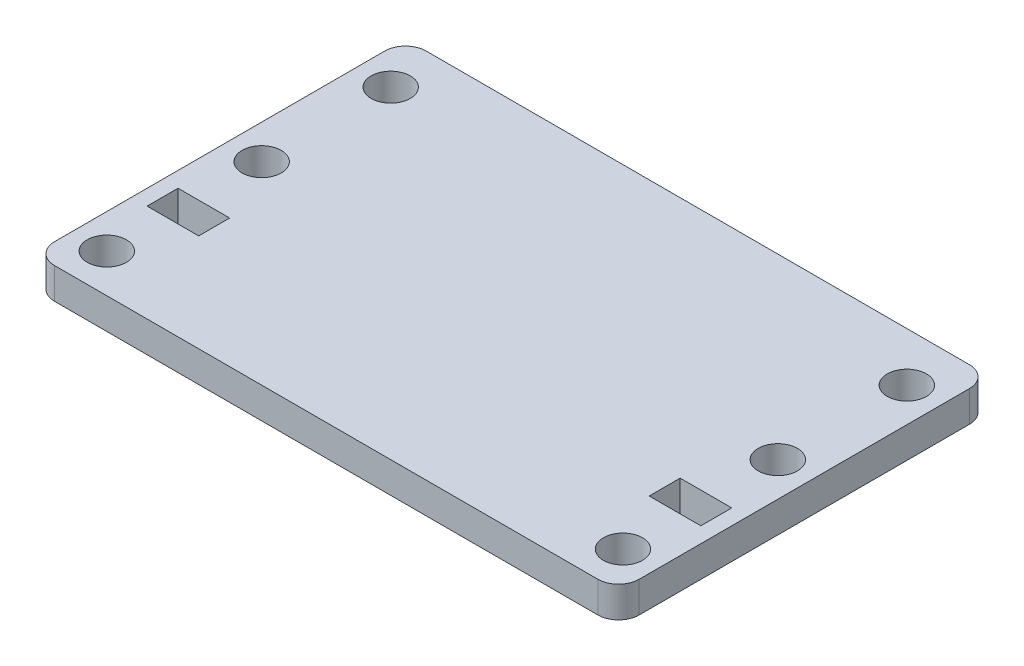
ISO-10303-21;
HEADER;
FILE_DESCRIPTION(('STEP AP214'),'2;1');
FILE_NAME('part.step','',(''),(''),'','','');
FILE_SCHEMA(('AUTOMOTIVE_DESIGN { 1 0 10303 214 1 1 1 1 }'));
ENDSEC;
DATA;
#1=APPLICATION_CONTEXT('core data for automotive mechanical design processes');
#2=APPLICATION_PROTOCOL_DEFINITION('international standard','automotive_design',2000,#1);
#3=PRODUCT_CONTEXT('',#1,'mechanical');
#4=PRODUCT('Part','Part','',(#3));
#5=PRODUCT_RELATED_PRODUCT_CATEGORY('part','',(#4));
#6=PRODUCT_DEFINITION_FORMATION('','',#4);
#7=PRODUCT_DEFINITION_CONTEXT('part definition',#1,'design');
#8=PRODUCT_DEFINITION('design','',#6,#7);
#9=PRODUCT_DEFINITION_SHAPE('','',#8);
#10=(LENGTH_UNIT() NAMED_UNIT(*) SI_UNIT(.MILLI.,.METRE.));
#11=(NAMED_UNIT(*) PLANE_ANGLE_UNIT() SI_UNIT($,.RADIAN.));
#12=(NAMED_UNIT(*) SI_UNIT($,.STERADIAN.) SOLID_ANGLE_UNIT());
#13=UNCERTAINTY_MEASURE_WITH_UNIT(LENGTH_MEASURE(1.E-05),#10,'distance_accuracy_value','');
#14=(GEOMETRIC_REPRESENTATION_CONTEXT(3) GLOBAL_UNCERTAINTY_ASSIGNED_CONTEXT((#13)) GLOBAL_UNIT_ASSIGNED_CONTEXT((#10,
#11,#12)) REPRESENTATION_CONTEXT('',''));
#15=CARTESIAN_POINT('',(0.,0.,0.));
#16=DIRECTION('',(0.,0.,1.));
#17=DIRECTION('',(1.,0.,0.));
#18=AXIS2_PLACEMENT_3D('',#15,#16,#17);
#19=CARTESIAN_POINT('',(0.,0.,0.));
#20=DIRECTION('',(0.,-1.,0.));
#21=DIRECTION('',(0.,0.,-1.));
#22=AXIS2_PLACEMENT_3D('',#19,#20,#21);
#23=PLANE('',#22);
#24=DIRECTION('',(0.,0.,-1.));
#25=VECTOR('',#24,1.);
#26=CARTESIAN_POINT('',(-55.14,0.,0.));
#27=LINE('',#26,#25);
#28=CARTESIAN_POINT('',(-55.14,0.,-9.47));
#29=VERTEX_POINT('',#28);
#30=CARTESIAN_POINT('',(-55.14,0.,-12.47));
#31=VERTEX_POINT('',#30);
#32=EDGE_CURVE('E215',#29,#31,#27,.T.);
#33=ORIENTED_EDGE('',*,*,#32,.F.);
#34=DIRECTION('',(-1.,0.,0.));
#35=VECTOR('',#34,1.);
#36=CARTESIAN_POINT('',(0.,0.,-9.46999999999998));
#37=LINE('',#36,#35);
#38=CARTESIAN_POINT('',(-50.14,0.,-9.47));
#39=VERTEX_POINT('',#38);
#40=EDGE_CURVE('E210',#39,#29,#37,.T.);
#41=ORIENTED_EDGE('',*,*,#40,.F.);
#42=DIRECTION('',(0.,0.,1.));
#43=VECTOR('',#42,1.);
#44=CARTESIAN_POINT('',(-50.14,0.,0.));
#45=LINE('',#44,#43);
#46=CARTESIAN_POINT('',(-50.14,0.,-12.47));
#47=VERTEX_POINT('',#46);
#48=EDGE_CURVE('E154',#47,#39,#45,.T.);
#49=ORIENTED_EDGE('',*,*,#48,.F.);
#50=DIRECTION('',(1.,0.,0.));
#51=VECTOR('',#50,1.);
#52=CARTESIAN_POINT('',(0.,0.,-12.47));
#53=LINE('',#52,#51);
#54=EDGE_CURVE('E213',#31,#47,#53,.T.);
#55=ORIENTED_EDGE('',*,*,#54,.F.);
#56=EDGE_LOOP('',(#33,#41,#49,#55));
#57=FACE_BOUND('',#56,.T.);
#58=DIRECTION('',(0.,0.,-1.));
#59=VECTOR('',#58,1.);
#60=CARTESIAN_POINT('',(-6.49999999999999,0.,0.));
#61=LINE('',#60,#59);
#62=CARTESIAN_POINT('',(-6.5,0.,-9.47));
#63=VERTEX_POINT('',#62);
#64=CARTESIAN_POINT('',(-6.5,0.,-12.47));
#65=VERTEX_POINT('',#64);
#66=EDGE_CURVE('E208',#63,#65,#61,.T.);
#67=ORIENTED_EDGE('',*,*,#66,.F.);
#68=DIRECTION('',(-1.,0.,0.));
#69=VECTOR('',#68,1.);
#70=CARTESIAN_POINT('',(0.,0.,-9.47));
#71=LINE('',#70,#69);
#72=CARTESIAN_POINT('',(-1.5,0.,-9.47));
#73=VERTEX_POINT('',#72);
#74=EDGE_CURVE('E179',#73,#63,#71,.T.);
#75=ORIENTED_EDGE('',*,*,#74,.F.);
#76=DIRECTION('',(0.,0.,1.));
#77=VECTOR('',#76,1.);
#78=CARTESIAN_POINT('',(-1.5,0.,0.));
#79=LINE('',#78,#77);
#80=CARTESIAN_POINT('',(-1.5,0.,-12.47));
#81=VERTEX_POINT('',#80);
#82=EDGE_CURVE('E203',#81,#73,#79,.T.);
#83=ORIENTED_EDGE('',*,*,#82,.F.);
#84=DIRECTION('',(1.,0.,0.));
#85=VECTOR('',#84,1.);
#86=CARTESIAN_POINT('',(0.,0.,-12.47));
#87=LINE('',#86,#85);
#88=EDGE_CURVE('E206',#65,#81,#87,.T.);
#89=ORIENTED_EDGE('',*,*,#88,.F.);
#90=EDGE_LOOP('',(#67,#75,#83,#89));
#91=FACE_BOUND('',#90,.T.);
#92=CARTESIAN_POINT('',(-53.32,0.,-31.25));
#93=DIRECTION('',(0.,1.,0.));
#94=DIRECTION('',(0.,0.,1.));
#95=AXIS2_PLACEMENT_3D('',#92,#93,#94);
#96=CIRCLE('',#95,1.89865);
#97=CARTESIAN_POINT('',(-53.32,0.,-29.35135));
#98=VERTEX_POINT('',#97);
#99=EDGE_CURVE('E220',#98,#98,#96,.T.);
#100=ORIENTED_EDGE('',*,*,#99,.T.);
#101=EDGE_LOOP('',(#100));
#102=FACE_BOUND('',#101,.T.);
#103=CARTESIAN_POINT('',(-3.31999999999999,0.,-18.75));
#104=DIRECTION('',(0.,1.,0.));
#105=DIRECTION('',(0.,0.,1.));
#106=AXIS2_PLACEMENT_3D('',#103,#104,#105);
#107=CIRCLE('',#106,1.89865);
#108=CARTESIAN_POINT('',(-3.31999999999999,0.,-16.85135));
#109=VERTEX_POINT('',#108);
#110=EDGE_CURVE('E244',#109,#109,#107,.T.);
#111=ORIENTED_EDGE('',*,*,#110,.T.);
#112=EDGE_LOOP('',(#111));
#113=FACE_BOUND('',#112,.T.);
#114=CARTESIAN_POINT('',(-3.31999999999999,0.,-3.75));
#115=DIRECTION('',(0.,1.,0.));
#116=DIRECTION('',(0.,0.,1.));
#117=AXIS2_PLACEMENT_3D('',#114,#115,#116);
#118=CIRCLE('',#117,1.89865);
#119=CARTESIAN_POINT('',(-3.31999999999999,0.,-1.85135));
#120=VERTEX_POINT('',#119);
#121=EDGE_CURVE('E250',#120,#120,#118,.T.);
#122=ORIENTED_EDGE('',*,*,#121,.T.);
#123=EDGE_LOOP('',(#122));
#124=FACE_BOUND('',#123,.T.);
#125=DIRECTION('',(0.,0.,1.));
#126=VECTOR('',#125,1.);
#127=CARTESIAN_POINT('',(-56.64,0.,-36.));
#128=LINE('',#127,#126);
#129=CARTESIAN_POINT('',(-56.64,0.,-34.));
#130=VERTEX_POINT('',#129);
#131=CARTESIAN_POINT('',(-56.64,0.,-2.));
#132=VERTEX_POINT('',#131);
#133=EDGE_CURVE('E271',#130,#132,#128,.T.);
#134=ORIENTED_EDGE('',*,*,#133,.F.);
#135=CARTESIAN_POINT('',(-54.64,0.,-34.));
#136=DIRECTION('',(0.,-1.,0.));
#137=DIRECTION('',(0.,0.,-1.));
#138=AXIS2_PLACEMENT_3D('',#135,#136,#137);
#139=CIRCLE('',#138,2.);
#140=CARTESIAN_POINT('',(-54.64,0.,-36.));
#141=VERTEX_POINT('',#140);
#142=EDGE_CURVE('E285',#130,#141,#139,.T.);
#143=ORIENTED_EDGE('',*,*,#142,.T.);
#144=DIRECTION('',(-1.,0.,0.));
#145=VECTOR('',#144,1.);
#146=CARTESIAN_POINT('',(0.,0.,-36.));
#147=LINE('',#146,#145);
#148=CARTESIAN_POINT('',(-2.,0.,-36.));
#149=VERTEX_POINT('',#148);
#150=EDGE_CURVE('E268',#149,#141,#147,.T.);
#151=ORIENTED_EDGE('',*,*,#150,.F.);
#152=CARTESIAN_POINT('',(-2.,0.,-34.));
#153=DIRECTION('',(0.,-1.,0.));
#154=DIRECTION('',(0.,0.,-1.));
#155=AXIS2_PLACEMENT_3D('',#152,#153,#154);
#156=CIRCLE('',#155,2.);
#157=CARTESIAN_POINT('',(0.,0.,-34.));
#158=VERTEX_POINT('',#157);
#159=EDGE_CURVE('E283',#149,#158,#156,.T.);
#160=ORIENTED_EDGE('',*,*,#159,.T.);
#161=DIRECTION('',(0.,0.,-1.));
#162=VECTOR('',#161,1.);
#163=CARTESIAN_POINT('',(0.,0.,-36.));
#164=LINE('',#163,#162);
#165=CARTESIAN_POINT('',(0.,0.,-2.));
#166=VERTEX_POINT('',#165);
#167=EDGE_CURVE('E253',#166,#158,#164,.T.);
#168=ORIENTED_EDGE('',*,*,#167,.F.);
#169=CARTESIAN_POINT('',(-2.,0.,-2.));
#170=DIRECTION('',(0.,-1.,0.));
#171=DIRECTION('',(0.,0.,-1.));
#172=AXIS2_PLACEMENT_3D('',#169,#170,#171);
#173=CIRCLE('',#172,2.);
#174=CARTESIAN_POINT('',(-2.,0.,0.));
#175=VERTEX_POINT('',#174);
#176=EDGE_CURVE('E281',#166,#175,#173,.T.);
#177=ORIENTED_EDGE('',*,*,#176,.T.);
#178=DIRECTION('',(1.,0.,0.));
#179=VECTOR('',#178,1.);
#180=CARTESIAN_POINT('',(0.,0.,0.));
#181=LINE('',#180,#179);
#182=CARTESIAN_POINT('',(-54.64,0.,0.));
#183=VERTEX_POINT('',#182);
#184=EDGE_CURVE('E258',#183,#175,#181,.T.);
#185=ORIENTED_EDGE('',*,*,#184,.F.);
#186=CARTESIAN_POINT('',(-54.64,0.,-2.));
#187=DIRECTION('',(0.,-1.,0.));
#188=DIRECTION('',(0.,0.,-1.));
#189=AXIS2_PLACEMENT_3D('',#186,#187,#188);
#190=CIRCLE('',#189,2.);
#191=EDGE_CURVE('E279',#183,#132,#190,.T.);
#192=ORIENTED_EDGE('',*,*,#191,.T.);
#193=EDGE_LOOP('',(#134,#143,#151,#160,#168,#177,#185,#192));
#194=FACE_BOUND('',#193,.T.);
#195=CARTESIAN_POINT('',(-3.31999999999999,0.,-31.25));
#196=DIRECTION('',(0.,1.,0.));
#197=DIRECTION('',(0.,0.,1.));
#198=AXIS2_PLACEMENT_3D('',#195,#196,#197);
#199=CIRCLE('',#198,1.89865);
#200=CARTESIAN_POINT('',(-3.31999999999999,0.,-29.35135));
#201=VERTEX_POINT('',#200);
#202=EDGE_CURVE('E238',#201,#201,#199,.T.);
#203=ORIENTED_EDGE('',*,*,#202,.T.);
#204=EDGE_LOOP('',(#203));
#205=FACE_BOUND('',#204,.T.);
#206=CARTESIAN_POINT('',(-53.32,0.,-3.75));
#207=DIRECTION('',(0.,1.,0.));
#208=DIRECTION('',(0.,0.,1.));
#209=AXIS2_PLACEMENT_3D('',#206,#207,#208);
#210=CIRCLE('',#209,1.89865);
#211=CARTESIAN_POINT('',(-53.32,0.,-1.85135));
#212=VERTEX_POINT('',#211);
#213=EDGE_CURVE('E232',#212,#212,#210,.T.);
#214=ORIENTED_EDGE('',*,*,#213,.T.);
#215=EDGE_LOOP('',(#214));
#216=FACE_BOUND('',#215,.T.);
#217=CARTESIAN_POINT('',(-53.32,0.,-18.75));
#218=DIRECTION('',(0.,1.,0.));
#219=DIRECTION('',(0.,0.,1.));
#220=AXIS2_PLACEMENT_3D('',#217,#218,#219);
#221=CIRCLE('',#220,1.89865);
#222=CARTESIAN_POINT('',(-53.32,0.,-16.85135));
#223=VERTEX_POINT('',#222);
#224=EDGE_CURVE('E226',#223,#223,#221,.T.);
#225=ORIENTED_EDGE('',*,*,#224,.T.);
#226=EDGE_LOOP('',(#225));
#227=FACE_BOUND('',#226,.T.);
#228=ADVANCED_FACE('F33',(#57,#91,#102,#113,#124,#194,#205,#216,#227),#23,.T.);
#229=CARTESIAN_POINT('',(0.,3.,-36.));
#230=DIRECTION('',(-1.,0.,0.));
#231=DIRECTION('',(0.,0.,1.));
#232=AXIS2_PLACEMENT_3D('',#229,#230,#231);
#233=PLANE('',#232);
#234=ORIENTED_EDGE('',*,*,#167,.T.);
#235=DIRECTION('',(0.,-1.,0.));
#236=VECTOR('',#235,1.);
#237=CARTESIAN_POINT('',(0.,3.,-34.));
#238=LINE('',#237,#236);
#239=CARTESIAN_POINT('',(0.,3.,-34.));
#240=VERTEX_POINT('',#239);
#241=EDGE_CURVE('E302',#158,#240,#238,.F.);
#242=ORIENTED_EDGE('',*,*,#241,.T.);
#243=DIRECTION('',(0.,0.,-1.));
#244=VECTOR('',#243,1.);
#245=CARTESIAN_POINT('',(0.,3.,-36.));
#246=LINE('',#245,#244);
#247=CARTESIAN_POINT('',(0.,3.,-2.));
#248=VERTEX_POINT('',#247);
#249=EDGE_CURVE('E254',#248,#240,#246,.T.);
#250=ORIENTED_EDGE('',*,*,#249,.F.);
#251=DIRECTION('',(0.,-1.,0.));
#252=VECTOR('',#251,1.);
#253=CARTESIAN_POINT('',(0.,3.,-2.));
#254=LINE('',#253,#252);
#255=EDGE_CURVE('E299',#248,#166,#254,.T.);
#256=ORIENTED_EDGE('',*,*,#255,.T.);
#257=EDGE_LOOP('',(#234,#242,#250,#256));
#258=FACE_BOUND('',#257,.T.);
#259=ADVANCED_FACE('F318',(#258),#233,.F.);
#260=CARTESIAN_POINT('',(0.,3.,-36.));
#261=DIRECTION('',(0.,0.,1.));
#262=DIRECTION('',(1.,0.,0.));
#263=AXIS2_PLACEMENT_3D('',#260,#261,#262);
#264=PLANE('',#263);
#265=ORIENTED_EDGE('',*,*,#150,.T.);
#266=DIRECTION('',(0.,-1.,0.));
#267=VECTOR('',#266,1.);
#268=CARTESIAN_POINT('',(-54.64,3.,-36.));
#269=LINE('',#268,#267);
#270=CARTESIAN_POINT('',(-54.64,3.,-36.));
#271=VERTEX_POINT('',#270);
#272=EDGE_CURVE('E290',#141,#271,#269,.F.);
#273=ORIENTED_EDGE('',*,*,#272,.T.);
#274=DIRECTION('',(-1.,0.,0.));
#275=VECTOR('',#274,1.);
#276=CARTESIAN_POINT('',(0.,3.,-36.));
#277=LINE('',#276,#275);
#278=CARTESIAN_POINT('',(-2.,3.,-36.));
#279=VERTEX_POINT('',#278);
#280=EDGE_CURVE('E257',#279,#271,#277,.T.);
#281=ORIENTED_EDGE('',*,*,#280,.F.);
#282=DIRECTION('',(0.,-1.,0.));
#283=VECTOR('',#282,1.);
#284=CARTESIAN_POINT('',(-2.,3.,-36.));
#285=LINE('',#284,#283);
#286=EDGE_CURVE('E287',#279,#149,#285,.T.);
#287=ORIENTED_EDGE('',*,*,#286,.T.);
#288=EDGE_LOOP('',(#265,#273,#281,#287));
#289=FACE_BOUND('',#288,.T.);
#290=ADVANCED_FACE('F327',(#289),#264,.F.);
#291=CARTESIAN_POINT('',(-56.64,3.,-36.));
#292=DIRECTION('',(1.,0.,0.));
#293=DIRECTION('',(0.,0.,-1.));
#294=AXIS2_PLACEMENT_3D('',#291,#292,#293);
#295=PLANE('',#294);
#296=DIRECTION('',(0.,0.,1.));
#297=VECTOR('',#296,1.);
#298=CARTESIAN_POINT('',(-56.64,3.,-36.));
#299=LINE('',#298,#297);
#300=CARTESIAN_POINT('',(-56.64,3.,-34.));
#301=VERTEX_POINT('',#300);
#302=CARTESIAN_POINT('',(-56.64,3.,-2.));
#303=VERTEX_POINT('',#302);
#304=EDGE_CURVE('E261',#301,#303,#299,.T.);
#305=ORIENTED_EDGE('',*,*,#304,.F.);
#306=DIRECTION('',(0.,-1.,0.));
#307=VECTOR('',#306,1.);
#308=CARTESIAN_POINT('',(-56.64,3.,-34.));
#309=LINE('',#308,#307);
#310=EDGE_CURVE('E276',#301,#130,#309,.T.);
#311=ORIENTED_EDGE('',*,*,#310,.T.);
#312=ORIENTED_EDGE('',*,*,#133,.T.);
#313=DIRECTION('',(0.,-1.,0.));
#314=VECTOR('',#313,1.);
#315=CARTESIAN_POINT('',(-56.64,3.,-2.));
#316=LINE('',#315,#314);
#317=EDGE_CURVE('E265',#132,#303,#316,.F.);
#318=ORIENTED_EDGE('',*,*,#317,.T.);
#319=EDGE_LOOP('',(#305,#311,#312,#318));
#320=FACE_BOUND('',#319,.T.);
#321=ADVANCED_FACE('F335',(#320),#295,.F.);
#322=CARTESIAN_POINT('',(0.,3.,0.));
#323=DIRECTION('',(0.,0.,-1.));
#324=DIRECTION('',(-1.,0.,0.));
#325=AXIS2_PLACEMENT_3D('',#322,#323,#324);
#326=PLANE('',#325);
#327=ORIENTED_EDGE('',*,*,#184,.T.);
#328=DIRECTION('',(0.,-1.,0.));
#329=VECTOR('',#328,1.);
#330=CARTESIAN_POINT('',(-2.,3.,0.));
#331=LINE('',#330,#329);
#332=CARTESIAN_POINT('',(-2.,3.,0.));
#333=VERTEX_POINT('',#332);
#334=EDGE_CURVE('E11',#175,#333,#331,.F.);
#335=ORIENTED_EDGE('',*,*,#334,.T.);
#336=DIRECTION('',(1.,0.,0.));
#337=VECTOR('',#336,1.);
#338=CARTESIAN_POINT('',(0.,3.,0.));
#339=LINE('',#338,#337);
#340=CARTESIAN_POINT('',(-54.64,3.,0.));
#341=VERTEX_POINT('',#340);
#342=EDGE_CURVE('E263',#341,#333,#339,.T.);
#343=ORIENTED_EDGE('',*,*,#342,.F.);
#344=DIRECTION('',(0.,-1.,0.));
#345=VECTOR('',#344,1.);
#346=CARTESIAN_POINT('',(-54.64,3.,0.));
#347=LINE('',#346,#345);
#348=EDGE_CURVE('E41',#341,#183,#347,.T.);
#349=ORIENTED_EDGE('',*,*,#348,.T.);
#350=EDGE_LOOP('',(#327,#335,#343,#349));
#351=FACE_BOUND('',#350,.T.);
#352=ADVANCED_FACE('F306',(#351),#326,.F.);
#353=CARTESIAN_POINT('',(0.,3.,0.));
#354=DIRECTION('',(0.,-1.,0.));
#355=DIRECTION('',(0.,0.,-1.));
#356=AXIS2_PLACEMENT_3D('',#353,#354,#355);
#357=PLANE('',#356);
#358=DIRECTION('',(1.,0.,0.));
#359=VECTOR('',#358,1.);
#360=CARTESIAN_POINT('',(-55.14,3.,-9.47));
#361=LINE('',#360,#359);
#362=CARTESIAN_POINT('',(-55.14,3.,-9.47));
#363=VERTEX_POINT('',#362);
#364=CARTESIAN_POINT('',(-50.14,3.,-9.47));
#365=VERTEX_POINT('',#364);
#366=EDGE_CURVE('E162',#363,#365,#361,.T.);
#367=ORIENTED_EDGE('',*,*,#366,.F.);
#368=DIRECTION('',(0.,0.,1.));
#369=VECTOR('',#368,1.);
#370=CARTESIAN_POINT('',(-55.14,3.,-12.47));
#371=LINE('',#370,#369);
#372=CARTESIAN_POINT('',(-55.14,3.,-12.47));
#373=VERTEX_POINT('',#372);
#374=EDGE_CURVE('E167',#373,#363,#371,.T.);
#375=ORIENTED_EDGE('',*,*,#374,.F.);
#376=DIRECTION('',(-1.,0.,0.));
#377=VECTOR('',#376,1.);
#378=CARTESIAN_POINT('',(-55.14,3.,-12.47));
#379=LINE('',#378,#377);
#380=CARTESIAN_POINT('',(-50.14,3.,-12.47));
#381=VERTEX_POINT('',#380);
#382=EDGE_CURVE('E172',#381,#373,#379,.T.);
#383=ORIENTED_EDGE('',*,*,#382,.F.);
#384=DIRECTION('',(0.,0.,-1.));
#385=VECTOR('',#384,1.);
#386=CARTESIAN_POINT('',(-50.14,3.,-12.47));
#387=LINE('',#386,#385);
#388=EDGE_CURVE('E151',#365,#381,#387,.T.);
#389=ORIENTED_EDGE('',*,*,#388,.F.);
#390=EDGE_LOOP('',(#367,#375,#383,#389));
#391=FACE_BOUND('',#390,.T.);
#392=DIRECTION('',(1.,0.,0.));
#393=VECTOR('',#392,1.);
#394=CARTESIAN_POINT('',(-6.5,3.,-9.47));
#395=LINE('',#394,#393);
#396=CARTESIAN_POINT('',(-6.5,3.,-9.47));
#397=VERTEX_POINT('',#396);
#398=CARTESIAN_POINT('',(-1.5,3.,-9.47));
#399=VERTEX_POINT('',#398);
#400=EDGE_CURVE('E184',#397,#399,#395,.T.);
#401=ORIENTED_EDGE('',*,*,#400,.F.);
#402=DIRECTION('',(0.,0.,1.));
#403=VECTOR('',#402,1.);
#404=CARTESIAN_POINT('',(-6.5,3.,-12.47));
#405=LINE('',#404,#403);
#406=CARTESIAN_POINT('',(-6.5,3.,-12.47));
#407=VERTEX_POINT('',#406);
#408=EDGE_CURVE('E182',#407,#397,#405,.T.);
#409=ORIENTED_EDGE('',*,*,#408,.F.);
#410=DIRECTION('',(-1.,0.,0.));
#411=VECTOR('',#410,1.);
#412=CARTESIAN_POINT('',(-6.5,3.,-12.47));
#413=LINE('',#412,#411);
#414=CARTESIAN_POINT('',(-1.5,3.,-12.47));
#415=VERTEX_POINT('',#414);
#416=EDGE_CURVE('E190',#415,#407,#413,.T.);
#417=ORIENTED_EDGE('',*,*,#416,.F.);
#418=DIRECTION('',(0.,0.,-1.));
#419=VECTOR('',#418,1.);
#420=CARTESIAN_POINT('',(-1.5,3.,-12.47));
#421=LINE('',#420,#419);
#422=EDGE_CURVE('E187',#399,#415,#421,.T.);
#423=ORIENTED_EDGE('',*,*,#422,.F.);
#424=EDGE_LOOP('',(#401,#409,#417,#423));
#425=FACE_BOUND('',#424,.T.);
#426=CARTESIAN_POINT('',(-53.32,3.,-31.25));
#427=DIRECTION('',(0.,1.,0.));
#428=DIRECTION('',(0.,0.,1.));
#429=AXIS2_PLACEMENT_3D('',#426,#427,#428);
#430=CIRCLE('',#429,1.89864999999999);
#431=CARTESIAN_POINT('',(-53.32,3.,-29.35135));
#432=VERTEX_POINT('',#431);
#433=EDGE_CURVE('E217',#432,#432,#430,.T.);
#434=ORIENTED_EDGE('',*,*,#433,.F.);
#435=EDGE_LOOP('',(#434));
#436=FACE_BOUND('',#435,.T.);
#437=CARTESIAN_POINT('',(-53.32,3.,-18.75));
#438=DIRECTION('',(0.,1.,0.));
#439=DIRECTION('',(0.,0.,1.));
#440=AXIS2_PLACEMENT_3D('',#437,#438,#439);
#441=CIRCLE('',#440,1.89864999999999);
#442=CARTESIAN_POINT('',(-53.32,3.,-16.85135));
#443=VERTEX_POINT('',#442);
#444=EDGE_CURVE('E223',#443,#443,#441,.T.);
#445=ORIENTED_EDGE('',*,*,#444,.F.);
#446=EDGE_LOOP('',(#445));
#447=FACE_BOUND('',#446,.T.);
#448=CARTESIAN_POINT('',(-53.32,3.,-3.75));
#449=DIRECTION('',(0.,1.,0.));
#450=DIRECTION('',(0.,0.,1.));
#451=AXIS2_PLACEMENT_3D('',#448,#449,#450);
#452=CIRCLE('',#451,1.89864999999999);
#453=CARTESIAN_POINT('',(-53.32,3.,-1.85135000000001));
#454=VERTEX_POINT('',#453);
#455=EDGE_CURVE('E229',#454,#454,#452,.T.);
#456=ORIENTED_EDGE('',*,*,#455,.F.);
#457=EDGE_LOOP('',(#456));
#458=FACE_BOUND('',#457,.T.);
#459=CARTESIAN_POINT('',(-3.31999999999999,3.,-31.25));
#460=DIRECTION('',(0.,1.,0.));
#461=DIRECTION('',(0.,0.,1.));
#462=AXIS2_PLACEMENT_3D('',#459,#460,#461);
#463=CIRCLE('',#462,1.89864999999999);
#464=CARTESIAN_POINT('',(-3.31999999999999,3.,-29.35135));
#465=VERTEX_POINT('',#464);
#466=EDGE_CURVE('E235',#465,#465,#463,.T.);
#467=ORIENTED_EDGE('',*,*,#466,.F.);
#468=EDGE_LOOP('',(#467));
#469=FACE_BOUND('',#468,.T.);
#470=CARTESIAN_POINT('',(-3.31999999999999,3.,-18.75));
#471=DIRECTION('',(0.,1.,0.));
#472=DIRECTION('',(0.,0.,1.));
#473=AXIS2_PLACEMENT_3D('',#470,#471,#472);
#474=CIRCLE('',#473,1.89864999999999);
#475=CARTESIAN_POINT('',(-3.31999999999999,3.,-16.85135));
#476=VERTEX_POINT('',#475);
#477=EDGE_CURVE('E241',#476,#476,#474,.T.);
#478=ORIENTED_EDGE('',*,*,#477,.F.);
#479=EDGE_LOOP('',(#478));
#480=FACE_BOUND('',#479,.T.);
#481=CARTESIAN_POINT('',(-3.31999999999999,3.,-3.75));
#482=DIRECTION('',(0.,1.,0.));
#483=DIRECTION('',(0.,0.,1.));
#484=AXIS2_PLACEMENT_3D('',#481,#482,#483);
#485=CIRCLE('',#484,1.89864999999999);
#486=CARTESIAN_POINT('',(-3.31999999999999,3.,-1.85135000000001));
#487=VERTEX_POINT('',#486);
#488=EDGE_CURVE('E247',#487,#487,#485,.T.);
#489=ORIENTED_EDGE('',*,*,#488,.F.);
#490=EDGE_LOOP('',(#489));
#491=FACE_BOUND('',#490,.T.);
#492=ORIENTED_EDGE('',*,*,#280,.T.);
#493=CARTESIAN_POINT('',(-54.64,3.,-34.));
#494=DIRECTION('',(0.,-1.,0.));
#495=DIRECTION('',(0.,0.,-1.));
#496=AXIS2_PLACEMENT_3D('',#493,#494,#495);
#497=CIRCLE('',#496,2.);
#498=EDGE_CURVE('E297',#271,#301,#497,.F.);
#499=ORIENTED_EDGE('',*,*,#498,.T.);
#500=ORIENTED_EDGE('',*,*,#304,.T.);
#501=CARTESIAN_POINT('',(-54.64,3.,-2.));
#502=DIRECTION('',(0.,-1.,0.));
#503=DIRECTION('',(0.,0.,-1.));
#504=AXIS2_PLACEMENT_3D('',#501,#502,#503);
#505=CIRCLE('',#504,2.);
#506=EDGE_CURVE('E53',#303,#341,#505,.F.);
#507=ORIENTED_EDGE('',*,*,#506,.T.);
#508=ORIENTED_EDGE('',*,*,#342,.T.);
#509=CARTESIAN_POINT('',(-2.,3.,-2.));
#510=DIRECTION('',(0.,-1.,0.));
#511=DIRECTION('',(0.,0.,-1.));
#512=AXIS2_PLACEMENT_3D('',#509,#510,#511);
#513=CIRCLE('',#512,2.);
#514=EDGE_CURVE('E293',#333,#248,#513,.F.);
#515=ORIENTED_EDGE('',*,*,#514,.T.);
#516=ORIENTED_EDGE('',*,*,#249,.T.);
#517=CARTESIAN_POINT('',(-2.,3.,-34.));
#518=DIRECTION('',(0.,-1.,0.));
#519=DIRECTION('',(0.,0.,-1.));
#520=AXIS2_PLACEMENT_3D('',#517,#518,#519);
#521=CIRCLE('',#520,2.);
#522=EDGE_CURVE('E295',#240,#279,#521,.F.);
#523=ORIENTED_EDGE('',*,*,#522,.T.);
#524=EDGE_LOOP('',(#492,#499,#500,#507,#508,#515,#516,#523));
#525=FACE_BOUND('',#524,.T.);
#526=ADVANCED_FACE('F169',(#391,#425,#436,#447,#458,#469,#480,#491,#525),#357,.F.);
#527=CARTESIAN_POINT('',(-3.31999999999999,3.,-3.75));
#528=DIRECTION('',(0.,1.,0.));
#529=DIRECTION('',(0.,0.,1.));
#530=AXIS2_PLACEMENT_3D('',#527,#528,#529);
#531=CYLINDRICAL_SURFACE('',#530,1.89864999999999);
#532=ORIENTED_EDGE('',*,*,#121,.F.);
#533=EDGE_LOOP('',(#532));
#534=FACE_BOUND('',#533,.T.);
#535=ORIENTED_EDGE('',*,*,#488,.T.);
#536=EDGE_LOOP('',(#535));
#537=FACE_BOUND('',#536,.T.);
#538=ADVANCED_FACE('F496',(#534,#537),#531,.F.);
#539=CARTESIAN_POINT('',(-3.31999999999999,3.,-18.75));
#540=DIRECTION('',(0.,1.,0.));
#541=DIRECTION('',(0.,0.,1.));
#542=AXIS2_PLACEMENT_3D('',#539,#540,#541);
#543=CYLINDRICAL_SURFACE('',#542,1.89864999999999);
#544=ORIENTED_EDGE('',*,*,#110,.F.);
#545=EDGE_LOOP('',(#544));
#546=FACE_BOUND('',#545,.T.);
#547=ORIENTED_EDGE('',*,*,#477,.T.);
#548=EDGE_LOOP('',(#547));
#549=FACE_BOUND('',#548,.T.);
#550=ADVANCED_FACE('F487',(#546,#549),#543,.F.);
#551=CARTESIAN_POINT('',(-3.31999999999999,3.,-31.25));
#552=DIRECTION('',(0.,1.,0.));
#553=DIRECTION('',(0.,0.,1.));
#554=AXIS2_PLACEMENT_3D('',#551,#552,#553);
#555=CYLINDRICAL_SURFACE('',#554,1.89864999999999);
#556=ORIENTED_EDGE('',*,*,#202,.F.);
#557=EDGE_LOOP('',(#556));
#558=FACE_BOUND('',#557,.T.);
#559=ORIENTED_EDGE('',*,*,#466,.T.);
#560=EDGE_LOOP('',(#559));
#561=FACE_BOUND('',#560,.T.);
#562=ADVANCED_FACE('F478',(#558,#561),#555,.F.);
#563=CARTESIAN_POINT('',(-53.32,3.,-3.75));
#564=DIRECTION('',(0.,1.,0.));
#565=DIRECTION('',(0.,0.,1.));
#566=AXIS2_PLACEMENT_3D('',#563,#564,#565);
#567=CYLINDRICAL_SURFACE('',#566,1.89864999999999);
#568=ORIENTED_EDGE('',*,*,#213,.F.);
#569=EDGE_LOOP('',(#568));
#570=FACE_BOUND('',#569,.T.);
#571=ORIENTED_EDGE('',*,*,#455,.T.);
#572=EDGE_LOOP('',(#571));
#573=FACE_BOUND('',#572,.T.);
#574=ADVANCED_FACE('F469',(#570,#573),#567,.F.);
#575=CARTESIAN_POINT('',(-53.32,3.,-18.75));
#576=DIRECTION('',(0.,1.,0.));
#577=DIRECTION('',(0.,0.,1.));
#578=AXIS2_PLACEMENT_3D('',#575,#576,#577);
#579=CYLINDRICAL_SURFACE('',#578,1.89864999999999);
#580=ORIENTED_EDGE('',*,*,#224,.F.);
#581=EDGE_LOOP('',(#580));
#582=FACE_BOUND('',#581,.T.);
#583=ORIENTED_EDGE('',*,*,#444,.T.);
#584=EDGE_LOOP('',(#583));
#585=FACE_BOUND('',#584,.T.);
#586=ADVANCED_FACE('F460',(#582,#585),#579,.F.);
#587=CARTESIAN_POINT('',(-53.32,3.,-31.25));
#588=DIRECTION('',(0.,1.,0.));
#589=DIRECTION('',(0.,0.,1.));
#590=AXIS2_PLACEMENT_3D('',#587,#588,#589);
#591=CYLINDRICAL_SURFACE('',#590,1.89864999999999);
#592=ORIENTED_EDGE('',*,*,#99,.F.);
#593=EDGE_LOOP('',(#592));
#594=FACE_BOUND('',#593,.T.);
#595=ORIENTED_EDGE('',*,*,#433,.T.);
#596=EDGE_LOOP('',(#595));
#597=FACE_BOUND('',#596,.T.);
#598=ADVANCED_FACE('F451',(#594,#597),#591,.F.);
#599=CARTESIAN_POINT('',(-6.5,-7.,-12.47));
#600=DIRECTION('',(-1.,0.,0.));
#601=DIRECTION('',(0.,0.,1.));
#602=AXIS2_PLACEMENT_3D('',#599,#600,#601);
#603=PLANE('',#602);
#604=ORIENTED_EDGE('',*,*,#66,.T.);
#605=DIRECTION('',(0.,1.,0.));
#606=VECTOR('',#605,1.);
#607=CARTESIAN_POINT('',(-6.5,-7.,-12.47));
#608=LINE('',#607,#606);
#609=EDGE_CURVE('E194',#65,#407,#608,.T.);
#610=ORIENTED_EDGE('',*,*,#609,.T.);
#611=ORIENTED_EDGE('',*,*,#408,.T.);
#612=DIRECTION('',(0.,1.,0.));
#613=VECTOR('',#612,1.);
#614=CARTESIAN_POINT('',(-6.5,-7.,-9.47));
#615=LINE('',#614,#613);
#616=EDGE_CURVE('E193',#63,#397,#615,.T.);
#617=ORIENTED_EDGE('',*,*,#616,.F.);
#618=EDGE_LOOP('',(#604,#610,#611,#617));
#619=FACE_BOUND('',#618,.T.);
#620=ADVANCED_FACE('F442',(#619),#603,.F.);
#621=CARTESIAN_POINT('',(-6.5,-7.,-12.47));
#622=DIRECTION('',(0.,0.,-1.));
#623=DIRECTION('',(-1.,0.,0.));
#624=AXIS2_PLACEMENT_3D('',#621,#622,#623);
#625=PLANE('',#624);
#626=ORIENTED_EDGE('',*,*,#88,.T.);
#627=DIRECTION('',(0.,1.,0.));
#628=VECTOR('',#627,1.);
#629=CARTESIAN_POINT('',(-1.5,-7.,-12.47));
#630=LINE('',#629,#628);
#631=EDGE_CURVE('E196',#81,#415,#630,.T.);
#632=ORIENTED_EDGE('',*,*,#631,.T.);
#633=ORIENTED_EDGE('',*,*,#416,.T.);
#634=ORIENTED_EDGE('',*,*,#609,.F.);
#635=EDGE_LOOP('',(#626,#632,#633,#634));
#636=FACE_BOUND('',#635,.T.);
#637=ADVANCED_FACE('F433',(#636),#625,.F.);
#638=CARTESIAN_POINT('',(-1.5,-7.,-12.47));
#639=DIRECTION('',(1.,0.,0.));
#640=DIRECTION('',(0.,0.,-1.));
#641=AXIS2_PLACEMENT_3D('',#638,#639,#640);
#642=PLANE('',#641);
#643=ORIENTED_EDGE('',*,*,#82,.T.);
#644=DIRECTION('',(0.,1.,0.));
#645=VECTOR('',#644,1.);
#646=CARTESIAN_POINT('',(-1.5,-7.,-9.47));
#647=LINE('',#646,#645);
#648=EDGE_CURVE('E198',#73,#399,#647,.T.);
#649=ORIENTED_EDGE('',*,*,#648,.T.);
#650=ORIENTED_EDGE('',*,*,#422,.T.);
#651=ORIENTED_EDGE('',*,*,#631,.F.);
#652=EDGE_LOOP('',(#643,#649,#650,#651));
#653=FACE_BOUND('',#652,.T.);
#654=ADVANCED_FACE('F424',(#653),#642,.F.);
#655=CARTESIAN_POINT('',(-6.5,-7.,-9.47));
#656=DIRECTION('',(0.,0.,1.));
#657=DIRECTION('',(1.,0.,0.));
#658=AXIS2_PLACEMENT_3D('',#655,#656,#657);
#659=PLANE('',#658);
#660=ORIENTED_EDGE('',*,*,#74,.T.);
#661=ORIENTED_EDGE('',*,*,#616,.T.);
#662=ORIENTED_EDGE('',*,*,#400,.T.);
#663=ORIENTED_EDGE('',*,*,#648,.F.);
#664=EDGE_LOOP('',(#660,#661,#662,#663));
#665=FACE_BOUND('',#664,.T.);
#666=ADVANCED_FACE('F415',(#665),#659,.F.);
#667=CARTESIAN_POINT('',(-55.14,-7.,-12.47));
#668=DIRECTION('',(-1.,0.,0.));
#669=DIRECTION('',(0.,0.,1.));
#670=AXIS2_PLACEMENT_3D('',#667,#668,#669);
#671=PLANE('',#670);
#672=ORIENTED_EDGE('',*,*,#32,.T.);
#673=DIRECTION('',(0.,1.,0.));
#674=VECTOR('',#673,1.);
#675=CARTESIAN_POINT('',(-55.14,-7.,-12.47));
#676=LINE('',#675,#674);
#677=EDGE_CURVE('E177',#31,#373,#676,.T.);
#678=ORIENTED_EDGE('',*,*,#677,.T.);
#679=ORIENTED_EDGE('',*,*,#374,.T.);
#680=DIRECTION('',(0.,1.,0.));
#681=VECTOR('',#680,1.);
#682=CARTESIAN_POINT('',(-55.14,-7.,-9.47));
#683=LINE('',#682,#681);
#684=EDGE_CURVE('E158',#29,#363,#683,.T.);
#685=ORIENTED_EDGE('',*,*,#684,.F.);
#686=EDGE_LOOP('',(#672,#678,#679,#685));
#687=FACE_BOUND('',#686,.T.);
#688=ADVANCED_FACE('F406',(#687),#671,.F.);
#689=CARTESIAN_POINT('',(-55.14,-7.,-12.47));
#690=DIRECTION('',(0.,0.,-1.));
#691=DIRECTION('',(-1.,0.,0.));
#692=AXIS2_PLACEMENT_3D('',#689,#690,#691);
#693=PLANE('',#692);
#694=ORIENTED_EDGE('',*,*,#54,.T.);
#695=DIRECTION('',(0.,1.,0.));
#696=VECTOR('',#695,1.);
#697=CARTESIAN_POINT('',(-50.14,-7.,-12.47));
#698=LINE('',#697,#696);
#699=EDGE_CURVE('E157',#47,#381,#698,.T.);
#700=ORIENTED_EDGE('',*,*,#699,.T.);
#701=ORIENTED_EDGE('',*,*,#382,.T.);
#702=ORIENTED_EDGE('',*,*,#677,.F.);
#703=EDGE_LOOP('',(#694,#700,#701,#702));
#704=FACE_BOUND('',#703,.T.);
#705=ADVANCED_FACE('F398',(#704),#693,.F.);
#706=CARTESIAN_POINT('',(-50.14,-7.,-12.47));
#707=DIRECTION('',(1.,0.,0.));
#708=DIRECTION('',(0.,0.,-1.));
#709=AXIS2_PLACEMENT_3D('',#706,#707,#708);
#710=PLANE('',#709);
#711=ORIENTED_EDGE('',*,*,#48,.T.);
#712=DIRECTION('',(0.,1.,0.));
#713=VECTOR('',#712,1.);
#714=CARTESIAN_POINT('',(-50.14,-7.,-9.47));
#715=LINE('',#714,#713);
#716=EDGE_CURVE('E146',#39,#365,#715,.T.);
#717=ORIENTED_EDGE('',*,*,#716,.T.);
#718=ORIENTED_EDGE('',*,*,#388,.T.);
#719=ORIENTED_EDGE('',*,*,#699,.F.);
#720=EDGE_LOOP('',(#711,#717,#718,#719));
#721=FACE_BOUND('',#720,.T.);
#722=ADVANCED_FACE('F148',(#721),#710,.F.);
#723=CARTESIAN_POINT('',(-55.14,-7.,-9.47));
#724=DIRECTION('',(0.,0.,1.));
#725=DIRECTION('',(1.,0.,0.));
#726=AXIS2_PLACEMENT_3D('',#723,#724,#725);
#727=PLANE('',#726);
#728=ORIENTED_EDGE('',*,*,#40,.T.);
#729=ORIENTED_EDGE('',*,*,#684,.T.);
#730=ORIENTED_EDGE('',*,*,#366,.T.);
#731=ORIENTED_EDGE('',*,*,#716,.F.);
#732=EDGE_LOOP('',(#728,#729,#730,#731));
#733=FACE_BOUND('',#732,.T.);
#734=ADVANCED_FACE('F163',(#733),#727,.F.);
#735=CARTESIAN_POINT('',(-54.64,3.,-34.));
#736=DIRECTION('',(0.,-1.,0.));
#737=DIRECTION('',(0.,0.,-1.));
#738=AXIS2_PLACEMENT_3D('',#735,#736,#737);
#739=CYLINDRICAL_SURFACE('',#738,2.);
#740=ORIENTED_EDGE('',*,*,#498,.F.);
#741=ORIENTED_EDGE('',*,*,#272,.F.);
#742=ORIENTED_EDGE('',*,*,#142,.F.);
#743=ORIENTED_EDGE('',*,*,#310,.F.);
#744=EDGE_LOOP('',(#740,#741,#742,#743));
#745=FACE_BOUND('',#744,.T.);
#746=ADVANCED_FACE('F332',(#745),#739,.T.);
#747=CARTESIAN_POINT('',(-2.,3.,-34.));
#748=DIRECTION('',(0.,-1.,0.));
#749=DIRECTION('',(0.,0.,-1.));
#750=AXIS2_PLACEMENT_3D('',#747,#748,#749);
#751=CYLINDRICAL_SURFACE('',#750,2.);
#752=ORIENTED_EDGE('',*,*,#522,.F.);
#753=ORIENTED_EDGE('',*,*,#241,.F.);
#754=ORIENTED_EDGE('',*,*,#159,.F.);
#755=ORIENTED_EDGE('',*,*,#286,.F.);
#756=EDGE_LOOP('',(#752,#753,#754,#755));
#757=FACE_BOUND('',#756,.T.);
#758=ADVANCED_FACE('F324',(#757),#751,.T.);
#759=CARTESIAN_POINT('',(-2.,3.,-2.));
#760=DIRECTION('',(0.,-1.,0.));
#761=DIRECTION('',(0.,0.,-1.));
#762=AXIS2_PLACEMENT_3D('',#759,#760,#761);
#763=CYLINDRICAL_SURFACE('',#762,2.);
#764=ORIENTED_EDGE('',*,*,#514,.F.);
#765=ORIENTED_EDGE('',*,*,#334,.F.);
#766=ORIENTED_EDGE('',*,*,#176,.F.);
#767=ORIENTED_EDGE('',*,*,#255,.F.);
#768=EDGE_LOOP('',(#764,#765,#766,#767));
#769=FACE_BOUND('',#768,.T.);
#770=ADVANCED_FACE('F315',(#769),#763,.T.);
#771=CARTESIAN_POINT('',(-54.64,3.,-2.));
#772=DIRECTION('',(0.,-1.,0.));
#773=DIRECTION('',(0.,0.,-1.));
#774=AXIS2_PLACEMENT_3D('',#771,#772,#773);
#775=CYLINDRICAL_SURFACE('',#774,2.);
#776=ORIENTED_EDGE('',*,*,#506,.F.);
#777=ORIENTED_EDGE('',*,*,#317,.F.);
#778=ORIENTED_EDGE('',*,*,#191,.F.);
#779=ORIENTED_EDGE('',*,*,#348,.F.);
#780=EDGE_LOOP('',(#776,#777,#778,#779));
#781=FACE_BOUND('',#780,.T.);
#782=ADVANCED_FACE('F35',(#781),#775,.T.);
#783=CLOSED_SHELL('',(#228,#259,#290,#321,#352,#526,#538,#550,#562,#574,#586,#598,#620,#637,
#654,#666,#688,#705,#722,#734,#746,#758,#770,#782));
#784=MANIFOLD_SOLID_BREP('B2',#783);
#785=ADVANCED_BREP_SHAPE_REPRESENTATION('',(#18,#784),#14);
#786=SHAPE_DEFINITION_REPRESENTATION(#9,#785);
ENDSEC;
END-ISO-10303-21;
